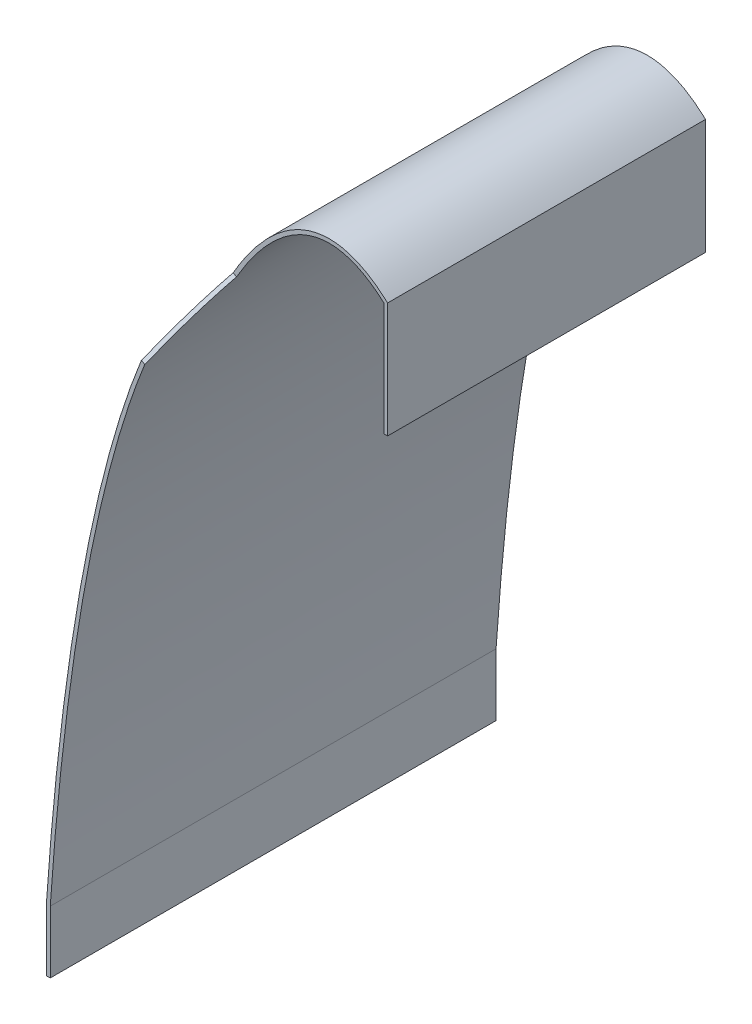
ISO-10303-21;
HEADER;
FILE_DESCRIPTION(('STEP AP214'),'2;1');
FILE_NAME('part.step','',(''),(''),'','','');
FILE_SCHEMA(('AUTOMOTIVE_DESIGN { 1 0 10303 214 1 1 1 1 }'));
ENDSEC;
DATA;
#1=APPLICATION_CONTEXT('core data for automotive mechanical design processes');
#2=APPLICATION_PROTOCOL_DEFINITION('international standard','automotive_design',2000,#1);
#3=PRODUCT_CONTEXT('',#1,'mechanical');
#4=PRODUCT('Part','Part','',(#3));
#5=PRODUCT_RELATED_PRODUCT_CATEGORY('part','',(#4));
#6=PRODUCT_DEFINITION_FORMATION('','',#4);
#7=PRODUCT_DEFINITION_CONTEXT('part definition',#1,'design');
#8=PRODUCT_DEFINITION('design','',#6,#7);
#9=PRODUCT_DEFINITION_SHAPE('','',#8);
#10=(LENGTH_UNIT() NAMED_UNIT(*) SI_UNIT(.MILLI.,.METRE.));
#11=(NAMED_UNIT(*) PLANE_ANGLE_UNIT() SI_UNIT($,.RADIAN.));
#12=(NAMED_UNIT(*) SI_UNIT($,.STERADIAN.) SOLID_ANGLE_UNIT());
#13=UNCERTAINTY_MEASURE_WITH_UNIT(LENGTH_MEASURE(1.E-05),#10,'distance_accuracy_value','');
#14=(GEOMETRIC_REPRESENTATION_CONTEXT(3) GLOBAL_UNCERTAINTY_ASSIGNED_CONTEXT((#13)) GLOBAL_UNIT_ASSIGNED_CONTEXT((#10,
#11,#12)) REPRESENTATION_CONTEXT('',''));
#15=CARTESIAN_POINT('',(0.,0.,0.));
#16=DIRECTION('',(0.,0.,1.));
#17=DIRECTION('',(1.,0.,0.));
#18=AXIS2_PLACEMENT_3D('',#15,#16,#17);
#19=CARTESIAN_POINT('',(-7.80404361134203,33.2925968801411,5.77));
#20=DIRECTION('',(0.,0.,-1.));
#21=DIRECTION('',(-1.,0.,0.));
#22=AXIS2_PLACEMENT_3D('',#19,#20,#21);
#23=PLANE('',#22);
#24=DIRECTION('',(-0.865409781380415,0.501064776542019,0.));
#25=VECTOR('',#24,1.);
#26=CARTESIAN_POINT('',(-7.26169658843694,34.3266467980915,5.77));
#27=LINE('',#26,#25);
#28=CARTESIAN_POINT('',(-7.14048219379415,34.2564647123045,5.77));
#29=VERTEX_POINT('',#28);
#30=CARTESIAN_POINT('',(-7.26169658843694,34.3266467980915,5.77));
#31=VERTEX_POINT('',#30);
#32=EDGE_CURVE('E171',#29,#31,#27,.T.);
#33=ORIENTED_EDGE('',*,*,#32,.F.);
#34=CARTESIAN_POINT('',(-11.58,13.4176222621012,5.77));
#35=CARTESIAN_POINT('',(-11.5408144595983,13.9936870587377,5.77));
#36=CARTESIAN_POINT('',(-11.4536336991551,15.1606820054322,5.77));
#37=CARTESIAN_POINT('',(-11.2575042724627,17.3691649825884,5.77));
#38=CARTESIAN_POINT('',(-10.9674095998831,19.9794938779718,5.77));
#39=CARTESIAN_POINT('',(-10.5545817666885,22.844416106936,5.77));
#40=CARTESIAN_POINT('',(-9.92438789749513,26.3167106357248,5.77));
#41=CARTESIAN_POINT('',(-9.00084386526891,30.0000903106088,5.77));
#42=CARTESIAN_POINT('',(-7.71894160477761,33.3669533763745,5.77));
#43=CARTESIAN_POINT('',(-6.30835519359976,35.6762848368512,5.77));
#44=CARTESIAN_POINT('',(-5.06951347754768,36.7146832397235,5.77));
#45=CARTESIAN_POINT('',(-4.06938660427321,37.021222010836,5.77));
#46=CARTESIAN_POINT('',(-3.3165776314463,36.9954788023564,5.77));
#47=CARTESIAN_POINT('',(-2.68182940651845,36.7570157141052,5.77));
#48=CARTESIAN_POINT('',(-2.17781558235397,36.4392351722406,5.77));
#49=CARTESIAN_POINT('',(-1.91641375792097,36.2276097203051,5.77));
#50=CARTESIAN_POINT('',(-1.795,36.1188515508097,5.77));
#51=B_SPLINE_CURVE_WITH_KNOTS('',3,(#34,#35,#36,#37,#38,#39,#40,#41,#42,#43,#44,#45,#46,#47,#48,
#49,#50),.UNSPECIFIED.,.F.,.F.,(4,1,1,1,1,1,1,1,1,1,1,1,1,1,4),(0.00188650732579807,
0.0330762406260859,0.0642659739263739,0.12664544052695,0.189024907127526,0.251404373728102,
0.376163306929253,0.500922240130405,0.625681173331557,0.750440106532709,0.812819573133285,
0.875199039733861,0.937578506334437,0.968768239634724,0.999957972935012),.UNSPECIFIED.);
#52=CARTESIAN_POINT('',(-1.795,36.1188515508097,5.77));
#53=VERTEX_POINT('',#52);
#54=EDGE_CURVE('E205',#29,#53,#51,.T.);
#55=ORIENTED_EDGE('',*,*,#54,.T.);
#56=DIRECTION('',(0.,-1.,0.));
#57=VECTOR('',#56,1.);
#58=CARTESIAN_POINT('',(-1.795,32.,5.77));
#59=LINE('',#58,#57);
#60=CARTESIAN_POINT('',(-1.795,32.,5.77));
#61=VERTEX_POINT('',#60);
#62=EDGE_CURVE('E299',#53,#61,#59,.T.);
#63=ORIENTED_EDGE('',*,*,#62,.T.);
#64=DIRECTION('',(1.,0.,0.));
#65=VECTOR('',#64,1.);
#66=CARTESIAN_POINT('',(-1.795,32.,5.77));
#67=LINE('',#66,#65);
#68=CARTESIAN_POINT('',(-1.655,32.,5.77));
#69=VERTEX_POINT('',#68);
#70=EDGE_CURVE('E194',#61,#69,#67,.T.);
#71=ORIENTED_EDGE('',*,*,#70,.T.);
#72=DIRECTION('',(0.,1.,0.));
#73=VECTOR('',#72,1.);
#74=CARTESIAN_POINT('',(-1.655,32.,5.77));
#75=LINE('',#74,#73);
#76=CARTESIAN_POINT('',(-1.65500000000001,36.1810247272065,5.77));
#77=VERTEX_POINT('',#76);
#78=EDGE_CURVE('E197',#69,#77,#75,.T.);
#79=ORIENTED_EDGE('',*,*,#78,.T.);
#80=CARTESIAN_POINT('',(-1.65500000000001,36.1810247272065,5.77));
#81=CARTESIAN_POINT('',(-1.78096177005899,36.2952124987903,5.77));
#82=CARTESIAN_POINT('',(-2.04925269874172,36.5197013682714,5.77));
#83=CARTESIAN_POINT('',(-2.57498419977409,36.8611649508068,5.77));
#84=CARTESIAN_POINT('',(-3.24462341899833,37.1263124290112,5.77));
#85=CARTESIAN_POINT('',(-4.05034759780294,37.168032280925,5.77));
#86=CARTESIAN_POINT('',(-5.11349255990061,36.8576367727967,5.77));
#87=CARTESIAN_POINT('',(-6.39418807931646,35.7967299774766,5.77));
#88=CARTESIAN_POINT('',(-7.82691865380377,33.4687246996312,5.77));
#89=CARTESIAN_POINT('',(-9.12239897352063,30.0839525048454,5.77));
#90=CARTESIAN_POINT('',(-10.053547866352,26.3834211983234,5.77));
#91=CARTESIAN_POINT('',(-10.6883835005946,22.8948795173548,5.77));
#92=CARTESIAN_POINT('',(-11.1039947972188,20.0163829888953,5.77));
#93=CARTESIAN_POINT('',(-11.3958453604708,17.3934360280784,5.77));
#94=CARTESIAN_POINT('',(-11.5930427204132,15.1741153692391,5.77));
#95=CARTESIAN_POINT('',(-11.6806302044536,14.0013033834734,5.77));
#96=CARTESIAN_POINT('',(-11.72,13.4223774255889,5.77));
#97=B_SPLINE_CURVE_WITH_KNOTS('',3,(#80,#81,#82,#83,#84,#85,#86,#87,#88,#89,#90,#91,#92,#93,#94,
#95,#96),.UNSPECIFIED.,.F.,.F.,(4,1,1,1,1,1,1,1,1,1,1,1,1,1,4),(-0.00186184682280529,
0.0294476486871229,0.0607571441970511,0.123376135216908,0.185995126236764,0.24861411725662,
0.373852099296333,0.499090081336046,0.624328063375759,0.749566045415472,0.812185036435328,
0.874804027455185,0.937423018475041,0.968732513984969,1.0000420094949),.UNSPECIFIED.);
#98=EDGE_CURVE('E199',#77,#31,#97,.T.);
#99=ORIENTED_EDGE('',*,*,#98,.T.);
#100=EDGE_LOOP('',(#33,#55,#63,#71,#79,#99));
#101=FACE_BOUND('',#100,.T.);
#102=ADVANCED_FACE('F45',(#101),#23,.F.);
#103=CARTESIAN_POINT('',(-1.795,32.,5.77));
#104=DIRECTION('',(0.,1.,0.));
#105=DIRECTION('',(0.,0.,1.));
#106=AXIS2_PLACEMENT_3D('',#103,#104,#105);
#107=PLANE('',#106);
#108=DIRECTION('',(1.,0.,0.));
#109=VECTOR('',#108,1.);
#110=CARTESIAN_POINT('',(-1.795,32.,-5.77));
#111=LINE('',#110,#109);
#112=CARTESIAN_POINT('',(-1.795,32.,-5.77));
#113=VERTEX_POINT('',#112);
#114=CARTESIAN_POINT('',(-1.655,32.,-5.77));
#115=VERTEX_POINT('',#114);
#116=EDGE_CURVE('E188',#113,#115,#111,.T.);
#117=ORIENTED_EDGE('',*,*,#116,.T.);
#118=DIRECTION('',(0.,0.,-1.));
#119=VECTOR('',#118,1.);
#120=CARTESIAN_POINT('',(-1.655,32.,5.77));
#121=LINE('',#120,#119);
#122=EDGE_CURVE('E329',#69,#115,#121,.T.);
#123=ORIENTED_EDGE('',*,*,#122,.F.);
#124=ORIENTED_EDGE('',*,*,#70,.F.);
#125=DIRECTION('',(0.,0.,-1.));
#126=VECTOR('',#125,1.);
#127=CARTESIAN_POINT('',(-1.795,32.,5.77));
#128=LINE('',#127,#126);
#129=EDGE_CURVE('E293',#61,#113,#128,.T.);
#130=ORIENTED_EDGE('',*,*,#129,.T.);
#131=EDGE_LOOP('',(#117,#123,#124,#130));
#132=FACE_BOUND('',#131,.T.);
#133=ADVANCED_FACE('F242',(#132),#107,.F.);
#134=CARTESIAN_POINT('',(-1.655,32.,5.77));
#135=DIRECTION('',(-1.,0.,0.));
#136=DIRECTION('',(0.,-1.,0.));
#137=AXIS2_PLACEMENT_3D('',#134,#135,#136);
#138=PLANE('',#137);
#139=DIRECTION('',(0.,1.,0.));
#140=VECTOR('',#139,1.);
#141=CARTESIAN_POINT('',(-1.655,32.,-5.77));
#142=LINE('',#141,#140);
#143=CARTESIAN_POINT('',(-1.65500000000001,36.1810247272065,-5.77));
#144=VERTEX_POINT('',#143);
#145=EDGE_CURVE('E301',#115,#144,#142,.T.);
#146=ORIENTED_EDGE('',*,*,#145,.T.);
#147=DIRECTION('',(0.,0.,-1.));
#148=VECTOR('',#147,1.);
#149=CARTESIAN_POINT('',(-1.65500000000001,36.1810247272065,5.77));
#150=LINE('',#149,#148);
#151=EDGE_CURVE('E327',#77,#144,#150,.T.);
#152=ORIENTED_EDGE('',*,*,#151,.F.);
#153=ORIENTED_EDGE('',*,*,#78,.F.);
#154=ORIENTED_EDGE('',*,*,#122,.T.);
#155=EDGE_LOOP('',(#146,#152,#153,#154));
#156=FACE_BOUND('',#155,.T.);
#157=ADVANCED_FACE('F220',(#156),#138,.F.);
#158=DIRECTION('',(0.,0.,-1.));
#159=VECTOR('',#158,1.);
#160=SURFACE_OF_LINEAR_EXTRUSION('',#97,#159);
#161=CARTESIAN_POINT('',(-1.65500000000001,36.1810247272065,-5.77));
#162=CARTESIAN_POINT('',(-1.78096177005899,36.2952124987903,-5.77));
#163=CARTESIAN_POINT('',(-2.04925269874172,36.5197013682714,-5.77));
#164=CARTESIAN_POINT('',(-2.57498419977409,36.8611649508068,-5.77));
#165=CARTESIAN_POINT('',(-3.24462341899833,37.1263124290112,-5.77));
#166=CARTESIAN_POINT('',(-4.05034759780294,37.168032280925,-5.77));
#167=CARTESIAN_POINT('',(-5.11349255990061,36.8576367727967,-5.77));
#168=CARTESIAN_POINT('',(-6.39418807931646,35.7967299774766,-5.77));
#169=CARTESIAN_POINT('',(-7.82691865380377,33.4687246996312,-5.77));
#170=CARTESIAN_POINT('',(-9.12239897352063,30.0839525048454,-5.77));
#171=CARTESIAN_POINT('',(-10.053547866352,26.3834211983234,-5.77));
#172=CARTESIAN_POINT('',(-10.6883835005946,22.8948795173548,-5.77));
#173=CARTESIAN_POINT('',(-11.1039947972188,20.0163829888953,-5.77));
#174=CARTESIAN_POINT('',(-11.3958453604708,17.3934360280784,-5.77));
#175=CARTESIAN_POINT('',(-11.5930427204132,15.1741153692391,-5.77));
#176=CARTESIAN_POINT('',(-11.6806302044536,14.0013033834734,-5.77));
#177=CARTESIAN_POINT('',(-11.72,13.4223774255889,-5.77));
#178=B_SPLINE_CURVE_WITH_KNOTS('',3,(#161,#162,#163,#164,#165,#166,#167,#168,#169,#170,#171,
#172,#173,#174,#175,#176,#177),.UNSPECIFIED.,.F.,.F.,(4,1,1,1,1,1,1,1,1,1,1,1,1,1,4),
(-0.00186184682280529,0.0294476486871229,0.0607571441970511,0.123376135216908,0.185995126236764,
0.24861411725662,0.373852099296333,0.499090081336046,0.624328063375759,0.749566045415472,
0.812185036435328,0.874804027455185,0.937423018475041,0.968732513984969,1.0000420094949),.UNSPECIFIED.);
#179=CARTESIAN_POINT('',(-7.26169658702923,34.3266468005229,-5.77));
#180=VERTEX_POINT('',#179);
#181=EDGE_CURVE('E151',#144,#180,#178,.T.);
#182=ORIENTED_EDGE('',*,*,#181,.T.);
#183=CARTESIAN_POINT('',(-7.26169658843694,34.3266467980915,-5.76999999999996));
#184=CARTESIAN_POINT('',(-7.3102453654954,34.2427849232628,-5.86690096888981));
#185=CARTESIAN_POINT('',(-7.35782759963077,34.1583657574771,-5.96379992221113));
#186=CARTESIAN_POINT('',(-7.45116995811811,33.9885548380046,-6.15752652090519));
#187=CARTESIAN_POINT('',(-7.49693098529685,33.9031635939016,-6.25435417765385));
#188=CARTESIAN_POINT('',(-7.58677759428092,33.7314905434353,-6.44794068578039));
#189=CARTESIAN_POINT('',(-7.6308636493521,33.6452089975227,-6.54469954889869));
#190=CARTESIAN_POINT('',(-7.7174833830728,33.4718226621919,-6.73815187697253));
#191=CARTESIAN_POINT('',(-7.76001723720236,33.3847179672432,-6.83484534810017));
#192=CARTESIAN_POINT('',(-7.84363728779175,33.2097541580846,-7.02815980189667));
#193=CARTESIAN_POINT('',(-7.88472359733198,33.1218951034741,-7.12478078964814));
#194=CARTESIAN_POINT('',(-7.96554915744087,32.9454617847386,-7.31796675065805));
#195=CARTESIAN_POINT('',(-8.00528817021438,32.8568873977397,-7.41453171110202));
#196=CARTESIAN_POINT('',(-8.08350443958087,32.679066738374,-7.60761086658076));
#197=CARTESIAN_POINT('',(-8.12198131926939,32.589820274917,-7.70412503813314));
#198=CARTESIAN_POINT('',(-8.19774738352833,32.4106925947204,-7.89710759074864));
#199=CARTESIAN_POINT('',(-8.23503609240855,32.3208111409244,-7.99357593861105));
#200=CARTESIAN_POINT('',(-8.27175873627258,32.2306531143734,-8.09));
#201=B_SPLINE_CURVE_WITH_KNOTS('',3,(#183,#184,#185,#186,#187,#188,#189,#190,#191,#192,#193,
#194,#195,#196,#197,#198,#199,#200),.UNSPECIFIED.,.F.,.F.,(4,2,2,2,2,2,2,2,4),(0.,
0.411107359128923,0.822008314890059,1.23279229321022,1.64352968663355,2.05423492229067,
2.46501227316913,2.87591119588194,3.2869726082756),.UNSPECIFIED.);
#202=CARTESIAN_POINT('',(-8.27175873625238,32.230653114423,-8.09));
#203=VERTEX_POINT('',#202);
#204=EDGE_CURVE('E154',#180,#203,#201,.T.);
#205=ORIENTED_EDGE('',*,*,#204,.T.);
#206=CARTESIAN_POINT('',(-1.65500000000001,36.1810247272065,-8.09));
#207=CARTESIAN_POINT('',(-1.78096177005899,36.2952124987903,-8.09));
#208=CARTESIAN_POINT('',(-2.04925269874172,36.5197013682714,-8.09));
#209=CARTESIAN_POINT('',(-2.57498419977409,36.8611649508068,-8.09));
#210=CARTESIAN_POINT('',(-3.24462341899833,37.1263124290112,-8.09));
#211=CARTESIAN_POINT('',(-4.05034759780294,37.168032280925,-8.09));
#212=CARTESIAN_POINT('',(-5.11349255990061,36.8576367727967,-8.09));
#213=CARTESIAN_POINT('',(-6.39418807931646,35.7967299774766,-8.09));
#214=CARTESIAN_POINT('',(-7.82691865380377,33.4687246996312,-8.09));
#215=CARTESIAN_POINT('',(-9.12239897352063,30.0839525048454,-8.09));
#216=CARTESIAN_POINT('',(-10.053547866352,26.3834211983234,-8.09));
#217=CARTESIAN_POINT('',(-10.6883835005946,22.8948795173548,-8.09));
#218=CARTESIAN_POINT('',(-11.1039947972188,20.0163829888953,-8.09));
#219=CARTESIAN_POINT('',(-11.3958453604708,17.3934360280784,-8.09));
#220=CARTESIAN_POINT('',(-11.5930427204132,15.1741153692391,-8.09));
#221=CARTESIAN_POINT('',(-11.6806302044536,14.0013033834734,-8.09));
#222=CARTESIAN_POINT('',(-11.72,13.4223774255889,-8.09));
#223=B_SPLINE_CURVE_WITH_KNOTS('',3,(#206,#207,#208,#209,#210,#211,#212,#213,#214,#215,#216,
#217,#218,#219,#220,#221,#222),.UNSPECIFIED.,.F.,.F.,(4,1,1,1,1,1,1,1,1,1,1,1,1,1,4),
(-0.00186184682280529,0.0294476486871229,0.0607571441970511,0.123376135216908,0.185995126236764,
0.24861411725662,0.373852099296333,0.499090081336046,0.624328063375759,0.749566045415472,
0.812185036435328,0.874804027455185,0.937423018475041,0.968732513984969,1.0000420094949),.UNSPECIFIED.);
#224=CARTESIAN_POINT('',(-11.72,13.4223774255889,-8.09));
#225=VERTEX_POINT('',#224);
#226=EDGE_CURVE('E161',#203,#225,#223,.T.);
#227=ORIENTED_EDGE('',*,*,#226,.T.);
#228=DIRECTION('',(0.,0.,-1.));
#229=VECTOR('',#228,1.);
#230=CARTESIAN_POINT('',(-11.72,13.4223774255889,5.77));
#231=LINE('',#230,#229);
#232=CARTESIAN_POINT('',(-11.72,13.4223774255889,8.09));
#233=VERTEX_POINT('',#232);
#234=EDGE_CURVE('E324',#233,#225,#231,.T.);
#235=ORIENTED_EDGE('',*,*,#234,.F.);
#236=CARTESIAN_POINT('',(-1.65500000000001,36.1810247272065,8.09));
#237=CARTESIAN_POINT('',(-1.78096177005899,36.2952124987903,8.09));
#238=CARTESIAN_POINT('',(-2.04925269874172,36.5197013682714,8.09));
#239=CARTESIAN_POINT('',(-2.57498419977409,36.8611649508068,8.09));
#240=CARTESIAN_POINT('',(-3.24462341899833,37.1263124290112,8.09));
#241=CARTESIAN_POINT('',(-4.05034759780294,37.168032280925,8.09));
#242=CARTESIAN_POINT('',(-5.11349255990061,36.8576367727967,8.09));
#243=CARTESIAN_POINT('',(-6.39418807931646,35.7967299774766,8.09));
#244=CARTESIAN_POINT('',(-7.82691865380377,33.4687246996312,8.09));
#245=CARTESIAN_POINT('',(-9.12239897352063,30.0839525048454,8.09));
#246=CARTESIAN_POINT('',(-10.053547866352,26.3834211983234,8.09));
#247=CARTESIAN_POINT('',(-10.6883835005946,22.8948795173548,8.09));
#248=CARTESIAN_POINT('',(-11.1039947972188,20.0163829888953,8.09));
#249=CARTESIAN_POINT('',(-11.3958453604708,17.3934360280784,8.09));
#250=CARTESIAN_POINT('',(-11.5930427204132,15.1741153692391,8.09));
#251=CARTESIAN_POINT('',(-11.6806302044536,14.0013033834734,8.09));
#252=CARTESIAN_POINT('',(-11.72,13.4223774255889,8.09));
#253=B_SPLINE_CURVE_WITH_KNOTS('',3,(#236,#237,#238,#239,#240,#241,#242,#243,#244,#245,#246,
#247,#248,#249,#250,#251,#252),.UNSPECIFIED.,.F.,.F.,(4,1,1,1,1,1,1,1,1,1,1,1,1,1,4),
(-0.00186184682280529,0.0294476486871229,0.0607571441970511,0.123376135216908,0.185995126236764,
0.24861411725662,0.373852099296333,0.499090081336046,0.624328063375759,0.749566045415472,
0.812185036435328,0.874804027455185,0.937423018475041,0.968732513984969,1.0000420094949),.UNSPECIFIED.);
#254=CARTESIAN_POINT('',(-8.27175873625238,32.230653114423,8.09));
#255=VERTEX_POINT('',#254);
#256=EDGE_CURVE('E183',#233,#255,#253,.F.);
#257=ORIENTED_EDGE('',*,*,#256,.T.);
#258=CARTESIAN_POINT('',(-8.27175873660926,32.2306531145683,8.09));
#259=CARTESIAN_POINT('',(-8.23503609252401,32.3208111410074,7.99357593859705));
#260=CARTESIAN_POINT('',(-8.19774738355355,32.4106925947562,7.89710759073028));
#261=CARTESIAN_POINT('',(-8.12198131922911,32.5898202749169,7.70412503811312));
#262=CARTESIAN_POINT('',(-8.08350443956526,32.6790667383849,7.60761086656343));
#263=CARTESIAN_POINT('',(-8.00528817021719,32.8568873977578,7.41453171108776));
#264=CARTESIAN_POINT('',(-7.96554915743744,32.9454617847527,7.31796675064417));
#265=CARTESIAN_POINT('',(-7.88472359732436,33.1218951034841,7.1247807896356));
#266=CARTESIAN_POINT('',(-7.84363728778618,33.2097541580947,7.0281598018851));
#267=CARTESIAN_POINT('',(-7.76001723719853,33.3847179672528,6.83484534809001));
#268=CARTESIAN_POINT('',(-7.71748338306866,33.4718226622007,6.73815187696281));
#269=CARTESIAN_POINT('',(-7.63086364934807,33.6452089975302,6.54469954889016));
#270=CARTESIAN_POINT('',(-7.58677759427731,33.7314905434422,6.44794068577263));
#271=CARTESIAN_POINT('',(-7.49693098529408,33.9031635939068,6.25435417764787));
#272=CARTESIAN_POINT('',(-7.45116995811577,33.9885548380089,6.15752652090024));
#273=CARTESIAN_POINT('',(-7.35782759962947,34.1583657574793,5.96379992220851));
#274=CARTESIAN_POINT('',(-7.31024536549471,34.2427849232639,5.8669009688885));
#275=CARTESIAN_POINT('',(-7.26169658843694,34.3266467980915,5.76999999999996));
#276=B_SPLINE_CURVE_WITH_KNOTS('',3,(#258,#259,#260,#261,#262,#263,#264,#265,#266,#267,#268,
#269,#270,#271,#272,#273,#274,#275),.UNSPECIFIED.,.F.,.F.,(4,2,2,2,2,2,2,2,4),(0.,
0.411061412383656,0.821960335092625,1.23273768596742,1.64344292162096,2.05418031504228,
2.46496429335924,2.875865249116,3.28697260823939),.UNSPECIFIED.);
#277=EDGE_CURVE('E226',#255,#31,#276,.T.);
#278=ORIENTED_EDGE('',*,*,#277,.T.);
#279=ORIENTED_EDGE('',*,*,#98,.F.);
#280=ORIENTED_EDGE('',*,*,#151,.T.);
#281=EDGE_LOOP('',(#182,#205,#227,#235,#257,#278,#279,#280));
#282=FACE_BOUND('',#281,.T.);
#283=ADVANCED_FACE('F214',(#282),#160,.F.);
#284=CARTESIAN_POINT('',(-11.72,11.16,5.77));
#285=DIRECTION('',(1.,0.,0.));
#286=DIRECTION('',(0.,0.,-1.));
#287=AXIS2_PLACEMENT_3D('',#284,#285,#286);
#288=PLANE('',#287);
#289=ORIENTED_EDGE('',*,*,#234,.T.);
#290=DIRECTION('',(0.,-1.,0.));
#291=VECTOR('',#290,1.);
#292=CARTESIAN_POINT('',(-11.72,11.16,-8.09));
#293=LINE('',#292,#291);
#294=CARTESIAN_POINT('',(-11.72,11.16,-8.09));
#295=VERTEX_POINT('',#294);
#296=EDGE_CURVE('E155',#225,#295,#293,.T.);
#297=ORIENTED_EDGE('',*,*,#296,.T.);
#298=DIRECTION('',(0.,0.,-1.));
#299=VECTOR('',#298,1.);
#300=CARTESIAN_POINT('',(-11.72,11.16,5.77));
#301=LINE('',#300,#299);
#302=CARTESIAN_POINT('',(-11.72,11.16,8.09));
#303=VERTEX_POINT('',#302);
#304=EDGE_CURVE('E322',#303,#295,#301,.T.);
#305=ORIENTED_EDGE('',*,*,#304,.F.);
#306=DIRECTION('',(0.,1.,0.));
#307=VECTOR('',#306,1.);
#308=CARTESIAN_POINT('',(-11.72,13.4223774255889,8.09));
#309=LINE('',#308,#307);
#310=EDGE_CURVE('E180',#303,#233,#309,.T.);
#311=ORIENTED_EDGE('',*,*,#310,.T.);
#312=EDGE_LOOP('',(#289,#297,#305,#311));
#313=FACE_BOUND('',#312,.T.);
#314=ADVANCED_FACE('F219',(#313),#288,.F.);
#315=CARTESIAN_POINT('',(-11.72,11.16,5.77));
#316=DIRECTION('',(0.,1.,0.));
#317=DIRECTION('',(0.,0.,1.));
#318=AXIS2_PLACEMENT_3D('',#315,#316,#317);
#319=PLANE('',#318);
#320=ORIENTED_EDGE('',*,*,#304,.T.);
#321=DIRECTION('',(1.,0.,0.));
#322=VECTOR('',#321,1.);
#323=CARTESIAN_POINT('',(-11.58,11.16,-8.09));
#324=LINE('',#323,#322);
#325=CARTESIAN_POINT('',(-11.58,11.16,-8.09));
#326=VERTEX_POINT('',#325);
#327=EDGE_CURVE('E158',#295,#326,#324,.T.);
#328=ORIENTED_EDGE('',*,*,#327,.T.);
#329=DIRECTION('',(0.,0.,-1.));
#330=VECTOR('',#329,1.);
#331=CARTESIAN_POINT('',(-11.58,11.16,5.77));
#332=LINE('',#331,#330);
#333=CARTESIAN_POINT('',(-11.58,11.16,8.09));
#334=VERTEX_POINT('',#333);
#335=EDGE_CURVE('E320',#334,#326,#332,.T.);
#336=ORIENTED_EDGE('',*,*,#335,.F.);
#337=DIRECTION('',(-1.,0.,0.));
#338=VECTOR('',#337,1.);
#339=CARTESIAN_POINT('',(-11.72,11.16,8.09));
#340=LINE('',#339,#338);
#341=EDGE_CURVE('E177',#334,#303,#340,.T.);
#342=ORIENTED_EDGE('',*,*,#341,.T.);
#343=EDGE_LOOP('',(#320,#328,#336,#342));
#344=FACE_BOUND('',#343,.T.);
#345=ADVANCED_FACE('F262',(#344),#319,.F.);
#346=CARTESIAN_POINT('',(-11.58,11.16,5.77));
#347=DIRECTION('',(-1.,0.,0.));
#348=DIRECTION('',(0.,0.,1.));
#349=AXIS2_PLACEMENT_3D('',#346,#347,#348);
#350=PLANE('',#349);
#351=ORIENTED_EDGE('',*,*,#335,.T.);
#352=DIRECTION('',(0.,1.,0.));
#353=VECTOR('',#352,1.);
#354=CARTESIAN_POINT('',(-11.58,13.4176222621012,-8.09));
#355=LINE('',#354,#353);
#356=CARTESIAN_POINT('',(-11.58,13.4176222621012,-8.09));
#357=VERTEX_POINT('',#356);
#358=EDGE_CURVE('E343',#326,#357,#355,.T.);
#359=ORIENTED_EDGE('',*,*,#358,.T.);
#360=DIRECTION('',(0.,0.,-1.));
#361=VECTOR('',#360,1.);
#362=CARTESIAN_POINT('',(-11.58,13.4176222621012,5.77));
#363=LINE('',#362,#361);
#364=CARTESIAN_POINT('',(-11.58,13.4176222621012,8.09));
#365=VERTEX_POINT('',#364);
#366=EDGE_CURVE('E318',#365,#357,#363,.T.);
#367=ORIENTED_EDGE('',*,*,#366,.F.);
#368=DIRECTION('',(0.,-1.,0.));
#369=VECTOR('',#368,1.);
#370=CARTESIAN_POINT('',(-11.58,11.16,8.09));
#371=LINE('',#370,#369);
#372=EDGE_CURVE('E170',#365,#334,#371,.T.);
#373=ORIENTED_EDGE('',*,*,#372,.T.);
#374=EDGE_LOOP('',(#351,#359,#367,#373));
#375=FACE_BOUND('',#374,.T.);
#376=ADVANCED_FACE('F258',(#375),#350,.F.);
#377=DIRECTION('',(0.,0.,-1.));
#378=VECTOR('',#377,1.);
#379=SURFACE_OF_LINEAR_EXTRUSION('',#51,#378);
#380=CARTESIAN_POINT('',(-11.58,13.4176222621012,-8.09));
#381=CARTESIAN_POINT('',(-11.5408144595983,13.9936870587377,-8.09));
#382=CARTESIAN_POINT('',(-11.4536336991551,15.1606820054322,-8.09));
#383=CARTESIAN_POINT('',(-11.2575042724627,17.3691649825884,-8.09));
#384=CARTESIAN_POINT('',(-10.9674095998831,19.9794938779718,-8.09));
#385=CARTESIAN_POINT('',(-10.5545817666885,22.844416106936,-8.09));
#386=CARTESIAN_POINT('',(-9.92438789749513,26.3167106357248,-8.09));
#387=CARTESIAN_POINT('',(-9.00084386526891,30.0000903106088,-8.09));
#388=CARTESIAN_POINT('',(-7.71894160477761,33.3669533763745,-8.09));
#389=CARTESIAN_POINT('',(-6.30835519359976,35.6762848368512,-8.09));
#390=CARTESIAN_POINT('',(-5.06951347754768,36.7146832397235,-8.09));
#391=CARTESIAN_POINT('',(-4.06938660427321,37.021222010836,-8.09));
#392=CARTESIAN_POINT('',(-3.3165776314463,36.9954788023564,-8.09));
#393=CARTESIAN_POINT('',(-2.68182940651845,36.7570157141052,-8.09));
#394=CARTESIAN_POINT('',(-2.17781558235397,36.4392351722406,-8.09));
#395=CARTESIAN_POINT('',(-1.91641375792097,36.2276097203051,-8.09));
#396=CARTESIAN_POINT('',(-1.795,36.1188515508097,-8.09));
#397=B_SPLINE_CURVE_WITH_KNOTS('',3,(#380,#381,#382,#383,#384,#385,#386,#387,#388,#389,#390,
#391,#392,#393,#394,#395,#396),.UNSPECIFIED.,.F.,.F.,(4,1,1,1,1,1,1,1,1,1,1,1,1,1,4),
(0.00188650732579807,0.0330762406260859,0.0642659739263739,0.12664544052695,0.189024907127526,
0.251404373728102,0.376163306929253,0.500922240130405,0.625681173331557,0.750440106532709,
0.812819573133285,0.875199039733861,0.937578506334437,0.968768239634724,0.999957972935012),.UNSPECIFIED.);
#398=CARTESIAN_POINT('',(-8.14944186771797,32.1598327056743,-8.09));
#399=VERTEX_POINT('',#398);
#400=EDGE_CURVE('E139',#357,#399,#397,.T.);
#401=ORIENTED_EDGE('',*,*,#400,.T.);
#402=CARTESIAN_POINT('',(-8.14944186771859,32.1598327056745,-8.09));
#403=CARTESIAN_POINT('',(-8.11279470741981,32.2500310791925,-7.99357884410695));
#404=CARTESIAN_POINT('',(-8.0755799938901,32.3399524795634,-7.8971130025517));
#405=CARTESIAN_POINT('',(-7.99995756450553,32.5191580103021,-7.70413504769184));
#406=CARTESIAN_POINT('',(-7.96155033175544,32.6084423811671,-7.60762296832536));
#407=CARTESIAN_POINT('',(-7.88346747581934,32.7863360871834,-7.4145474463314));
#408=CARTESIAN_POINT('',(-7.84379223633173,32.8749456166774,-7.31798402777569));
#409=CARTESIAN_POINT('',(-7.76308617737554,33.0514453992848,-7.1248004260993));
#410=CARTESIAN_POINT('',(-7.72205560066004,33.1393357777236,-7.02818025615574));
#411=CARTESIAN_POINT('',(-7.63853632200556,33.3143573550679,-6.83486630247339));
#412=CARTESIAN_POINT('',(-7.59604750359042,33.4014884926292,-6.73817251346032));
#413=CARTESIAN_POINT('',(-7.50950675412464,33.5749223542328,-6.54471863191317));
#414=CARTESIAN_POINT('',(-7.46545464447482,33.6612249821812,-6.44795853304989));
#415=CARTESIAN_POINT('',(-7.37566352903293,33.8329341651895,-6.25436856132728));
#416=CARTESIAN_POINT('',(-7.32992404037649,33.9183404546282,-6.15753867639286));
#417=CARTESIAN_POINT('',(-7.23660950324185,34.0881738610785,-5.96380655754815));
#418=CARTESIAN_POINT('',(-7.1890335314774,34.1726004570656,-5.8669043119113));
#419=CARTESIAN_POINT('',(-7.14048219381803,34.2564647122633,-5.76999999999996));
#420=B_SPLINE_CURVE_WITH_KNOTS('',3,(#402,#403,#404,#405,#406,#407,#408,#409,#410,#411,#412,
#413,#414,#415,#416,#417,#418,#419),.UNSPECIFIED.,.F.,.F.,(4,2,2,2,2,2,2,2,4),(0.,
0.411074335660377,0.82198425857022,1.23277099612369,1.64348455282166,2.05423099171296,
2.46502450862246,2.87593650519143,3.28705784810911),.UNSPECIFIED.);
#421=CARTESIAN_POINT('',(-7.14048219381803,34.2564647122633,-5.77));
#422=VERTEX_POINT('',#421);
#423=EDGE_CURVE('E54',#399,#422,#420,.T.);
#424=ORIENTED_EDGE('',*,*,#423,.T.);
#425=CARTESIAN_POINT('',(-11.58,13.4176222621012,-5.77));
#426=CARTESIAN_POINT('',(-11.5408144595983,13.9936870587377,-5.77));
#427=CARTESIAN_POINT('',(-11.4536336991551,15.1606820054322,-5.77));
#428=CARTESIAN_POINT('',(-11.2575042724627,17.3691649825884,-5.77));
#429=CARTESIAN_POINT('',(-10.9674095998831,19.9794938779718,-5.77));
#430=CARTESIAN_POINT('',(-10.5545817666885,22.844416106936,-5.77));
#431=CARTESIAN_POINT('',(-9.92438789749513,26.3167106357248,-5.77));
#432=CARTESIAN_POINT('',(-9.00084386526891,30.0000903106088,-5.77));
#433=CARTESIAN_POINT('',(-7.71894160477761,33.3669533763745,-5.77));
#434=CARTESIAN_POINT('',(-6.30835519359976,35.6762848368512,-5.77));
#435=CARTESIAN_POINT('',(-5.06951347754768,36.7146832397235,-5.77));
#436=CARTESIAN_POINT('',(-4.06938660427321,37.021222010836,-5.77));
#437=CARTESIAN_POINT('',(-3.3165776314463,36.9954788023564,-5.77));
#438=CARTESIAN_POINT('',(-2.68182940651845,36.7570157141052,-5.77));
#439=CARTESIAN_POINT('',(-2.17781558235397,36.4392351722406,-5.77));
#440=CARTESIAN_POINT('',(-1.91641375792097,36.2276097203051,-5.77));
#441=CARTESIAN_POINT('',(-1.795,36.1188515508097,-5.77));
#442=B_SPLINE_CURVE_WITH_KNOTS('',3,(#425,#426,#427,#428,#429,#430,#431,#432,#433,#434,#435,
#436,#437,#438,#439,#440,#441),.UNSPECIFIED.,.F.,.F.,(4,1,1,1,1,1,1,1,1,1,1,1,1,1,4),
(0.00188650732579807,0.0330762406260859,0.0642659739263739,0.12664544052695,0.189024907127526,
0.251404373728102,0.376163306929253,0.500922240130405,0.625681173331557,0.750440106532709,
0.812819573133285,0.875199039733861,0.937578506334437,0.968768239634724,0.999957972935012),.UNSPECIFIED.);
#443=CARTESIAN_POINT('',(-1.795,36.1188515508097,-5.77));
#444=VERTEX_POINT('',#443);
#445=EDGE_CURVE('E137',#422,#444,#442,.T.);
#446=ORIENTED_EDGE('',*,*,#445,.T.);
#447=DIRECTION('',(0.,0.,-1.));
#448=VECTOR('',#447,1.);
#449=CARTESIAN_POINT('',(-1.795,36.1188515508097,5.77));
#450=LINE('',#449,#448);
#451=EDGE_CURVE('E295',#53,#444,#450,.T.);
#452=ORIENTED_EDGE('',*,*,#451,.F.);
#453=ORIENTED_EDGE('',*,*,#54,.F.);
#454=CARTESIAN_POINT('',(-7.14048219381802,34.2564647122633,5.76999999999996));
#455=CARTESIAN_POINT('',(-7.1890335314774,34.1726004570656,5.8669043119113));
#456=CARTESIAN_POINT('',(-7.23660950324185,34.0881738610785,5.96380655754815));
#457=CARTESIAN_POINT('',(-7.3299240403765,33.9183404546282,6.15753867639286));
#458=CARTESIAN_POINT('',(-7.37566352903294,33.8329341651895,6.25436856132728));
#459=CARTESIAN_POINT('',(-7.46545464447483,33.6612249821812,6.4479585330499));
#460=CARTESIAN_POINT('',(-7.50950675412464,33.5749223542328,6.54471863191318));
#461=CARTESIAN_POINT('',(-7.59604750359042,33.4014884926292,6.73817251346033));
#462=CARTESIAN_POINT('',(-7.63853632200557,33.3143573550679,6.8348663024734));
#463=CARTESIAN_POINT('',(-7.72205560066005,33.1393357777236,7.02818025615575));
#464=CARTESIAN_POINT('',(-7.76308617737555,33.0514453992847,7.12480042609932));
#465=CARTESIAN_POINT('',(-7.84379223633173,32.8749456166774,7.31798402777571));
#466=CARTESIAN_POINT('',(-7.88346747581933,32.7863360871834,7.41454744633142));
#467=CARTESIAN_POINT('',(-7.96155033175546,32.6084423811671,7.60762296832539));
#468=CARTESIAN_POINT('',(-7.9999575645056,32.5191580103021,7.70413504769186));
#469=CARTESIAN_POINT('',(-8.07557999389005,32.3399524795634,7.89711300255172));
#470=CARTESIAN_POINT('',(-8.1127947074196,32.2500310791924,7.99357884410697));
#471=CARTESIAN_POINT('',(-8.149441867718,32.1598327056742,8.09));
#472=B_SPLINE_CURVE_WITH_KNOTS('',3,(#454,#455,#456,#457,#458,#459,#460,#461,#462,#463,#464,
#465,#466,#467,#468,#469,#470,#471),.UNSPECIFIED.,.F.,.F.,(4,2,2,2,2,2,2,2,4),(0.,
0.411121342917695,0.822033339486672,1.23282685639617,1.64357329528748,2.05428685198545,
2.46507358953893,2.87598351244877,3.28705784810917),.UNSPECIFIED.);
#473=CARTESIAN_POINT('',(-8.14944186771797,32.1598327056743,8.09));
#474=VERTEX_POINT('',#473);
#475=EDGE_CURVE('E61',#29,#474,#472,.T.);
#476=ORIENTED_EDGE('',*,*,#475,.T.);
#477=CARTESIAN_POINT('',(-11.58,13.4176222621012,8.09));
#478=CARTESIAN_POINT('',(-11.5408144595983,13.9936870587377,8.09));
#479=CARTESIAN_POINT('',(-11.4536336991551,15.1606820054322,8.09));
#480=CARTESIAN_POINT('',(-11.2575042724627,17.3691649825884,8.09));
#481=CARTESIAN_POINT('',(-10.9674095998831,19.9794938779718,8.09));
#482=CARTESIAN_POINT('',(-10.5545817666885,22.844416106936,8.09));
#483=CARTESIAN_POINT('',(-9.92438789749513,26.3167106357248,8.09));
#484=CARTESIAN_POINT('',(-9.00084386526891,30.0000903106088,8.09));
#485=CARTESIAN_POINT('',(-7.71894160477761,33.3669533763745,8.09));
#486=CARTESIAN_POINT('',(-6.30835519359976,35.6762848368512,8.09));
#487=CARTESIAN_POINT('',(-5.06951347754768,36.7146832397235,8.09));
#488=CARTESIAN_POINT('',(-4.06938660427321,37.021222010836,8.09));
#489=CARTESIAN_POINT('',(-3.3165776314463,36.9954788023564,8.09));
#490=CARTESIAN_POINT('',(-2.68182940651845,36.7570157141052,8.09));
#491=CARTESIAN_POINT('',(-2.17781558235397,36.4392351722406,8.09));
#492=CARTESIAN_POINT('',(-1.91641375792097,36.2276097203051,8.09));
#493=CARTESIAN_POINT('',(-1.795,36.1188515508097,8.09));
#494=B_SPLINE_CURVE_WITH_KNOTS('',3,(#477,#478,#479,#480,#481,#482,#483,#484,#485,#486,#487,
#488,#489,#490,#491,#492,#493),.UNSPECIFIED.,.F.,.F.,(4,1,1,1,1,1,1,1,1,1,1,1,1,1,4),
(0.00188650732579807,0.0330762406260859,0.0642659739263739,0.12664544052695,0.189024907127526,
0.251404373728102,0.376163306929253,0.500922240130405,0.625681173331557,0.750440106532709,
0.812819573133285,0.875199039733861,0.937578506334437,0.968768239634724,0.999957972935012),.UNSPECIFIED.);
#495=EDGE_CURVE('E166',#474,#365,#494,.F.);
#496=ORIENTED_EDGE('',*,*,#495,.T.);
#497=ORIENTED_EDGE('',*,*,#366,.T.);
#498=EDGE_LOOP('',(#401,#424,#446,#452,#453,#476,#496,#497));
#499=FACE_BOUND('',#498,.T.);
#500=ADVANCED_FACE('F135',(#499),#379,.F.);
#501=CARTESIAN_POINT('',(-1.795,32.,5.77));
#502=DIRECTION('',(1.,0.,0.));
#503=DIRECTION('',(0.,1.,0.));
#504=AXIS2_PLACEMENT_3D('',#501,#502,#503);
#505=PLANE('',#504);
#506=DIRECTION('',(0.,-1.,0.));
#507=VECTOR('',#506,1.);
#508=CARTESIAN_POINT('',(-1.795,32.,-5.77));
#509=LINE('',#508,#507);
#510=EDGE_CURVE('E150',#444,#113,#509,.T.);
#511=ORIENTED_EDGE('',*,*,#510,.T.);
#512=ORIENTED_EDGE('',*,*,#129,.F.);
#513=ORIENTED_EDGE('',*,*,#62,.F.);
#514=ORIENTED_EDGE('',*,*,#451,.T.);
#515=EDGE_LOOP('',(#511,#512,#513,#514));
#516=FACE_BOUND('',#515,.T.);
#517=ADVANCED_FACE('F257',(#516),#505,.F.);
#518=CARTESIAN_POINT('',(-7.80404361134203,33.2925968801411,-5.77));
#519=DIRECTION('',(0.,0.,-1.));
#520=DIRECTION('',(-1.,0.,0.));
#521=AXIS2_PLACEMENT_3D('',#518,#519,#520);
#522=PLANE('',#521);
#523=DIRECTION('',(0.865409781380382,-0.501064776542075,0.));
#524=VECTOR('',#523,1.);
#525=CARTESIAN_POINT('',(-7.26169658843694,34.3266467980915,-5.77));
#526=LINE('',#525,#524);
#527=EDGE_CURVE('E147',#180,#422,#526,.T.);
#528=ORIENTED_EDGE('',*,*,#527,.F.);
#529=ORIENTED_EDGE('',*,*,#181,.F.);
#530=ORIENTED_EDGE('',*,*,#145,.F.);
#531=ORIENTED_EDGE('',*,*,#116,.F.);
#532=ORIENTED_EDGE('',*,*,#510,.F.);
#533=ORIENTED_EDGE('',*,*,#445,.F.);
#534=EDGE_LOOP('',(#528,#529,#530,#531,#532,#533));
#535=FACE_BOUND('',#534,.T.);
#536=ADVANCED_FACE('F145',(#535),#522,.T.);
#537=CARTESIAN_POINT('',(-9.93000000000001,11.16,8.09));
#538=DIRECTION('',(0.,0.,-1.));
#539=DIRECTION('',(0.,1.,0.));
#540=AXIS2_PLACEMENT_3D('',#537,#538,#539);
#541=PLANE('',#540);
#542=ORIENTED_EDGE('',*,*,#495,.F.);
#543=DIRECTION('',(-0.865409781380415,0.501064776542019,0.));
#544=VECTOR('',#543,1.);
#545=CARTESIAN_POINT('',(-0.376881561703976,27.6595875308623,8.09));
#546=LINE('',#545,#544);
#547=EDGE_CURVE('E13',#474,#255,#546,.T.);
#548=ORIENTED_EDGE('',*,*,#547,.T.);
#549=ORIENTED_EDGE('',*,*,#256,.F.);
#550=ORIENTED_EDGE('',*,*,#310,.F.);
#551=ORIENTED_EDGE('',*,*,#341,.F.);
#552=ORIENTED_EDGE('',*,*,#372,.F.);
#553=EDGE_LOOP('',(#542,#548,#549,#550,#551,#552));
#554=FACE_BOUND('',#553,.T.);
#555=ADVANCED_FACE('F279',(#554),#541,.F.);
#556=CARTESIAN_POINT('',(-9.93000000000001,12.2,-8.09));
#557=DIRECTION('',(0.,0.,1.));
#558=DIRECTION('',(1.,0.,0.));
#559=AXIS2_PLACEMENT_3D('',#556,#557,#558);
#560=PLANE('',#559);
#561=ORIENTED_EDGE('',*,*,#226,.F.);
#562=DIRECTION('',(0.865409781380382,-0.501064776542075,0.));
#563=VECTOR('',#562,1.);
#564=CARTESIAN_POINT('',(-0.827852974776878,27.9206960775639,-8.09));
#565=LINE('',#564,#563);
#566=EDGE_CURVE('E69',#203,#399,#565,.T.);
#567=ORIENTED_EDGE('',*,*,#566,.T.);
#568=ORIENTED_EDGE('',*,*,#400,.F.);
#569=ORIENTED_EDGE('',*,*,#358,.F.);
#570=ORIENTED_EDGE('',*,*,#327,.F.);
#571=ORIENTED_EDGE('',*,*,#296,.F.);
#572=EDGE_LOOP('',(#561,#567,#568,#569,#570,#571));
#573=FACE_BOUND('',#572,.T.);
#574=ADVANCED_FACE('F241',(#573),#560,.F.);
#575=CARTESIAN_POINT('',(-7.26169658843694,34.3266467980915,-5.76999999999996));
#576=DIRECTION('',(-0.354306301306626,-0.61193712491924,0.707106781186543));
#577=DIRECTION('',(-0.865409781380382,0.501064776542075,0.));
#578=AXIS2_PLACEMENT_3D('',#575,#576,#577);
#579=PLANE('',#578);
#580=ORIENTED_EDGE('',*,*,#423,.F.);
#581=ORIENTED_EDGE('',*,*,#566,.F.);
#582=ORIENTED_EDGE('',*,*,#204,.F.);
#583=ORIENTED_EDGE('',*,*,#527,.T.);
#584=EDGE_LOOP('',(#580,#581,#582,#583));
#585=FACE_BOUND('',#584,.T.);
#586=ADVANCED_FACE('F153',(#585),#579,.F.);
#587=CARTESIAN_POINT('',(-7.26169658843694,34.3266467980915,5.76999999999996));
#588=DIRECTION('',(-0.354306301306585,-0.611937124919262,-0.707106781186544));
#589=DIRECTION('',(0.865409781380415,-0.501064776542019,0.));
#590=AXIS2_PLACEMENT_3D('',#587,#588,#589);
#591=PLANE('',#590);
#592=ORIENTED_EDGE('',*,*,#277,.F.);
#593=ORIENTED_EDGE('',*,*,#547,.F.);
#594=ORIENTED_EDGE('',*,*,#475,.F.);
#595=ORIENTED_EDGE('',*,*,#32,.T.);
#596=EDGE_LOOP('',(#592,#593,#594,#595));
#597=FACE_BOUND('',#596,.T.);
#598=ADVANCED_FACE('F47',(#597),#591,.F.);
#599=CLOSED_SHELL('',(#102,#133,#157,#283,#314,#345,#376,#500,#517,#536,#555,#574,#586,#598));
#600=MANIFOLD_SOLID_BREP('B2',#599);
#601=ADVANCED_BREP_SHAPE_REPRESENTATION('',(#18,#600),#14);
#602=SHAPE_DEFINITION_REPRESENTATION(#9,#601);
ENDSEC;
END-ISO-10303-21;
